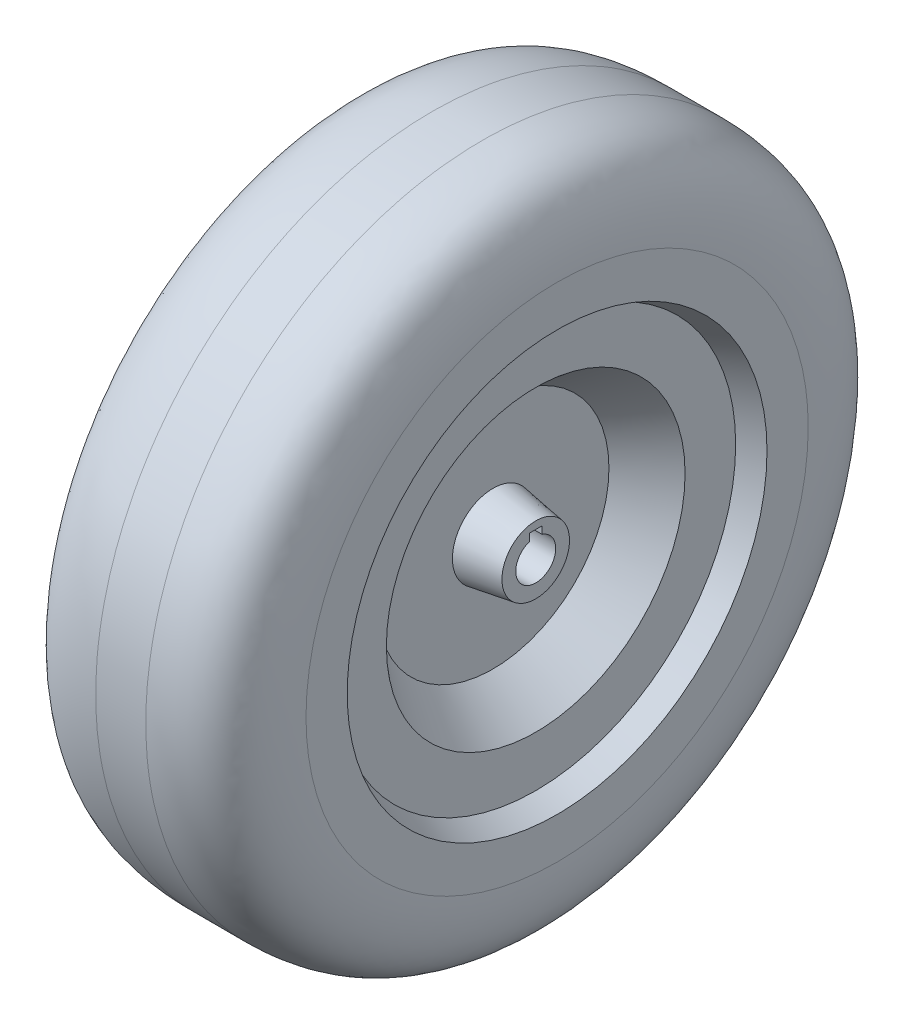
ISO-10303-21;
HEADER;
FILE_DESCRIPTION(('STEP AP214'),'2;1');
FILE_NAME('part.step','',(''),(''),'','','');
FILE_SCHEMA(('AUTOMOTIVE_DESIGN { 1 0 10303 214 1 1 1 1 }'));
ENDSEC;
DATA;
#1=APPLICATION_CONTEXT('core data for automotive mechanical design processes');
#2=APPLICATION_PROTOCOL_DEFINITION('international standard','automotive_design',2000,#1);
#3=PRODUCT_CONTEXT('',#1,'mechanical');
#4=PRODUCT('Part','Part','',(#3));
#5=PRODUCT_RELATED_PRODUCT_CATEGORY('part','',(#4));
#6=PRODUCT_DEFINITION_FORMATION('','',#4);
#7=PRODUCT_DEFINITION_CONTEXT('part definition',#1,'design');
#8=PRODUCT_DEFINITION('design','',#6,#7);
#9=PRODUCT_DEFINITION_SHAPE('','',#8);
#10=(LENGTH_UNIT() NAMED_UNIT(*) SI_UNIT(.MILLI.,.METRE.));
#11=(NAMED_UNIT(*) PLANE_ANGLE_UNIT() SI_UNIT($,.RADIAN.));
#12=(NAMED_UNIT(*) SI_UNIT($,.STERADIAN.) SOLID_ANGLE_UNIT());
#13=UNCERTAINTY_MEASURE_WITH_UNIT(LENGTH_MEASURE(1.E-05),#10,'distance_accuracy_value','');
#14=(GEOMETRIC_REPRESENTATION_CONTEXT(3) GLOBAL_UNCERTAINTY_ASSIGNED_CONTEXT((#13)) GLOBAL_UNIT_ASSIGNED_CONTEXT((#10,
#11,#12)) REPRESENTATION_CONTEXT('',''));
#15=CARTESIAN_POINT('',(0.,0.,0.));
#16=DIRECTION('',(0.,0.,1.));
#17=DIRECTION('',(1.,0.,0.));
#18=AXIS2_PLACEMENT_3D('',#15,#16,#17);
#19=CARTESIAN_POINT('',(-89.84,0.,0.));
#20=DIRECTION('',(-1.,0.,0.));
#21=DIRECTION('',(0.,0.,-1.));
#22=AXIS2_PLACEMENT_3D('',#19,#20,#21);
#23=PLANE('',#22);
#24=DIRECTION('',(0.,-1.,0.));
#25=VECTOR('',#24,1.);
#26=CARTESIAN_POINT('',(-89.84,0.,-3.));
#27=LINE('',#26,#25);
#28=CARTESIAN_POINT('',(-89.84,12.5,-3.));
#29=VERTEX_POINT('',#28);
#30=CARTESIAN_POINT('',(-89.84,9.01387818865997,-3.));
#31=VERTEX_POINT('',#30);
#32=EDGE_CURVE('E78',#29,#31,#27,.T.);
#33=ORIENTED_EDGE('',*,*,#32,.F.);
#34=DIRECTION('',(0.,0.,1.));
#35=VECTOR('',#34,1.);
#36=CARTESIAN_POINT('',(-89.84,12.5,0.));
#37=LINE('',#36,#35);
#38=CARTESIAN_POINT('',(-89.84,12.5,3.));
#39=VERTEX_POINT('',#38);
#40=EDGE_CURVE('E103',#29,#39,#37,.T.);
#41=ORIENTED_EDGE('',*,*,#40,.T.);
#42=DIRECTION('',(0.,-1.,0.));
#43=VECTOR('',#42,1.);
#44=CARTESIAN_POINT('',(-89.84,0.,3.));
#45=LINE('',#44,#43);
#46=CARTESIAN_POINT('',(-89.84,9.01387818865997,3.));
#47=VERTEX_POINT('',#46);
#48=EDGE_CURVE('E94',#39,#47,#45,.T.);
#49=ORIENTED_EDGE('',*,*,#48,.T.);
#50=CARTESIAN_POINT('',(-89.84,0.,0.));
#51=DIRECTION('',(1.,0.,0.));
#52=DIRECTION('',(0.,0.,-1.));
#53=AXIS2_PLACEMENT_3D('',#50,#51,#52);
#54=CIRCLE('',#53,9.5);
#55=EDGE_CURVE('E131',#47,#31,#54,.T.);
#56=ORIENTED_EDGE('',*,*,#55,.T.);
#57=EDGE_LOOP('',(#33,#41,#49,#56));
#58=FACE_BOUND('',#57,.T.);
#59=CARTESIAN_POINT('',(-89.84,0.,0.));
#60=DIRECTION('',(-1.,0.,0.));
#61=DIRECTION('',(0.,-1.,0.));
#62=AXIS2_PLACEMENT_3D('',#59,#60,#61);
#63=CIRCLE('',#62,16.0655);
#64=CARTESIAN_POINT('',(-89.84,-16.0655,0.));
#65=VERTEX_POINT('',#64);
#66=EDGE_CURVE('E123',#65,#65,#63,.T.);
#67=ORIENTED_EDGE('',*,*,#66,.T.);
#68=EDGE_LOOP('',(#67));
#69=FACE_BOUND('',#68,.T.);
#70=ADVANCED_FACE('F50',(#58,#69),#23,.T.);
#71=CARTESIAN_POINT('',(-100.,0.,0.));
#72=DIRECTION('',(1.,0.,0.));
#73=DIRECTION('',(0.,0.,-1.));
#74=AXIS2_PLACEMENT_3D('',#71,#72,#73);
#75=CYLINDRICAL_SURFACE('',#74,9.5);
#76=CARTESIAN_POINT('',(-10.16,0.,0.));
#77=DIRECTION('',(1.,0.,0.));
#78=DIRECTION('',(0.,0.,-1.));
#79=AXIS2_PLACEMENT_3D('',#76,#77,#78);
#80=CIRCLE('',#79,9.5);
#81=CARTESIAN_POINT('',(-10.16,9.01387818865997,3.));
#82=VERTEX_POINT('',#81);
#83=CARTESIAN_POINT('',(-10.16,9.01387818865997,-3.));
#84=VERTEX_POINT('',#83);
#85=EDGE_CURVE('E158',#82,#84,#80,.T.);
#86=ORIENTED_EDGE('',*,*,#85,.T.);
#87=DIRECTION('',(1.,0.,0.));
#88=VECTOR('',#87,1.);
#89=CARTESIAN_POINT('',(-100.,9.01387818865997,-3.));
#90=LINE('',#89,#88);
#91=EDGE_CURVE('E115',#84,#31,#90,.F.);
#92=ORIENTED_EDGE('',*,*,#91,.T.);
#93=ORIENTED_EDGE('',*,*,#55,.F.);
#94=DIRECTION('',(1.,0.,0.));
#95=VECTOR('',#94,1.);
#96=CARTESIAN_POINT('',(-100.,9.01387818865997,3.));
#97=LINE('',#96,#95);
#98=EDGE_CURVE('E97',#82,#47,#97,.F.);
#99=ORIENTED_EDGE('',*,*,#98,.F.);
#100=EDGE_LOOP('',(#86,#92,#93,#99));
#101=FACE_BOUND('',#100,.T.);
#102=ADVANCED_FACE('F293',(#101),#75,.F.);
#103=CARTESIAN_POINT('',(-10.16,0.,0.));
#104=DIRECTION('',(1.,0.,0.));
#105=DIRECTION('',(0.,0.,-1.));
#106=AXIS2_PLACEMENT_3D('',#103,#104,#105);
#107=PLANE('',#106);
#108=DIRECTION('',(0.,1.,0.));
#109=VECTOR('',#108,1.);
#110=CARTESIAN_POINT('',(-10.16,0.,-3.));
#111=LINE('',#110,#109);
#112=CARTESIAN_POINT('',(-10.16,12.5,-3.));
#113=VERTEX_POINT('',#112);
#114=EDGE_CURVE('E12',#84,#113,#111,.T.);
#115=ORIENTED_EDGE('',*,*,#114,.F.);
#116=ORIENTED_EDGE('',*,*,#85,.F.);
#117=DIRECTION('',(0.,1.,0.));
#118=VECTOR('',#117,1.);
#119=CARTESIAN_POINT('',(-10.16,0.,3.));
#120=LINE('',#119,#118);
#121=CARTESIAN_POINT('',(-10.16,12.5,3.));
#122=VERTEX_POINT('',#121);
#123=EDGE_CURVE('E279',#82,#122,#120,.T.);
#124=ORIENTED_EDGE('',*,*,#123,.T.);
#125=DIRECTION('',(0.,0.,-1.));
#126=VECTOR('',#125,1.);
#127=CARTESIAN_POINT('',(-10.16,12.5,0.));
#128=LINE('',#127,#126);
#129=EDGE_CURVE('E63',#122,#113,#128,.T.);
#130=ORIENTED_EDGE('',*,*,#129,.T.);
#131=EDGE_LOOP('',(#115,#116,#124,#130));
#132=FACE_BOUND('',#131,.T.);
#133=CARTESIAN_POINT('',(-10.16,0.,0.));
#134=DIRECTION('',(-1.,0.,0.));
#135=DIRECTION('',(0.,-1.,0.));
#136=AXIS2_PLACEMENT_3D('',#133,#134,#135);
#137=CIRCLE('',#136,16.0655);
#138=CARTESIAN_POINT('',(-10.16,-16.0655,0.));
#139=VERTEX_POINT('',#138);
#140=EDGE_CURVE('E150',#139,#139,#137,.T.);
#141=ORIENTED_EDGE('',*,*,#140,.F.);
#142=EDGE_LOOP('',(#141));
#143=FACE_BOUND('',#142,.T.);
#144=ADVANCED_FACE('F289',(#132,#143),#107,.T.);
#145=CARTESIAN_POINT('',(-30.48,0.,0.));
#146=DIRECTION('',(1.,0.,0.));
#147=DIRECTION('',(0.,0.,-1.));
#148=AXIS2_PLACEMENT_3D('',#145,#146,#147);
#149=PLANE('',#148);
#150=CARTESIAN_POINT('',(-30.48,0.,0.));
#151=DIRECTION('',(1.,0.,0.));
#152=DIRECTION('',(0.,0.,-1.));
#153=AXIS2_PLACEMENT_3D('',#150,#151,#152);
#154=CIRCLE('',#153,55.1311425095124);
#155=CARTESIAN_POINT('',(-30.48,0.,-55.1311425095124));
#156=VERTEX_POINT('',#155);
#157=EDGE_CURVE('E166',#156,#156,#154,.T.);
#158=ORIENTED_EDGE('',*,*,#157,.T.);
#159=EDGE_LOOP('',(#158));
#160=FACE_BOUND('',#159,.T.);
#161=CARTESIAN_POINT('',(-30.48,0.,0.));
#162=DIRECTION('',(-1.,0.,0.));
#163=DIRECTION('',(0.,-1.,0.));
#164=AXIS2_PLACEMENT_3D('',#161,#162,#163);
#165=CIRCLE('',#164,19.2847995634458);
#166=CARTESIAN_POINT('',(-30.48,-19.2847995634458,0.));
#167=VERTEX_POINT('',#166);
#168=EDGE_CURVE('E154',#167,#167,#165,.T.);
#169=ORIENTED_EDGE('',*,*,#168,.T.);
#170=EDGE_LOOP('',(#169));
#171=FACE_BOUND('',#170,.T.);
#172=ADVANCED_FACE('F206',(#160,#171),#149,.T.);
#173=CARTESIAN_POINT('',(-100.,0.,0.));
#174=DIRECTION('',(1.,0.,0.));
#175=DIRECTION('',(0.,0.,-1.));
#176=AXIS2_PLACEMENT_3D('',#173,#174,#175);
#177=CYLINDRICAL_SURFACE('',#176,160.02);
#178=CARTESIAN_POINT('',(-35.56,0.,-160.02));
#179=CARTESIAN_POINT('',(-35.56,20.9465690178169,-160.02));
#180=CARTESIAN_POINT('',(-35.56,41.8848964553655,-155.855107720384));
#181=CARTESIAN_POINT('',(-35.56,80.5891092387578,-139.823297864528));
#182=CARTESIAN_POINT('',(-35.56,98.3397661305281,-127.962688120415));
#183=CARTESIAN_POINT('',(-35.56,127.962688120415,-98.3397661305281));
#184=CARTESIAN_POINT('',(-35.56,139.823297864571,-80.5891092386546));
#185=CARTESIAN_POINT('',(-35.56,155.855107720341,-41.8848964554685));
#186=CARTESIAN_POINT('',(-35.56,160.02,-20.946569017565));
#187=CARTESIAN_POINT('',(-35.56,160.02,20.946569017565));
#188=CARTESIAN_POINT('',(-35.56,155.855107720398,41.8848964553299));
#189=CARTESIAN_POINT('',(-35.56,139.823297864514,80.5891092387936));
#190=CARTESIAN_POINT('',(-35.56,127.962688120414,98.3397661305282));
#191=CARTESIAN_POINT('',(-35.56,98.339766130528,127.962688120415));
#192=CARTESIAN_POINT('',(-35.56,80.5891092387474,139.823297864533));
#193=CARTESIAN_POINT('',(-35.56,41.8848964553763,155.855107720379));
#194=CARTESIAN_POINT('',(-35.56,20.946569017565,160.02));
#195=CARTESIAN_POINT('',(-35.56,-20.946569017565,160.02));
#196=CARTESIAN_POINT('',(-35.56,-41.8848964554988,155.855107720328));
#197=CARTESIAN_POINT('',(-35.56,-80.5891092386241,139.823297864584));
#198=CARTESIAN_POINT('',(-35.56,-98.3397661305282,127.962688120414));
#199=CARTESIAN_POINT('',(-35.56,-127.962688120415,98.339766130528));
#200=CARTESIAN_POINT('',(-35.56,-139.823297864526,80.5891092387633));
#201=CARTESIAN_POINT('',(-35.56,-155.855107720386,41.8848964553604));
#202=CARTESIAN_POINT('',(-35.56,-160.02,20.9465690175648));
#203=CARTESIAN_POINT('',(-35.56,-160.02,-20.9465690175653));
#204=CARTESIAN_POINT('',(-35.56,-155.855107720328,-41.8848964554988));
#205=CARTESIAN_POINT('',(-35.56,-139.823297864584,-80.589109238624));
#206=CARTESIAN_POINT('',(-35.56,-127.962688120415,-98.3397661305277));
#207=CARTESIAN_POINT('',(-35.56,-98.3397661305285,-127.962688120414));
#208=CARTESIAN_POINT('',(-35.56,-80.5891092388241,-139.823297864501));
#209=CARTESIAN_POINT('',(-35.56,-41.8848964552996,-155.855107720411));
#210=CARTESIAN_POINT('',(-35.56,-20.9465690178169,-160.02));
#211=CARTESIAN_POINT('',(-35.56,0.,-160.02));
#212=(BOUNDED_CURVE() B_SPLINE_CURVE(3,(#178,#179,#180,#181,#182,#183,#184,#185,#186,#187,#188,
#189,#190,#191,#192,#193,#194,#195,#196,#197,#198,#199,#200,#201,#202,#203,#204,#205,#206,#207,
#208,#209,#210,#211),.UNSPECIFIED.,.T.,.F.) B_SPLINE_CURVE_WITH_KNOTS((4,2,2,2,2,2,2,2,2,2,2,2,
2,2,2,2,4),(0.,0.392699081698724,0.785398163397448,1.17809724509617,1.5707963267949,
1.96349540849362,2.35619449019234,2.74889357189107,3.14159265358979,3.53429173528852,
3.92699081698724,4.31968989868597,4.71238898038469,5.10508806208341,5.49778714378214,
5.89048622548086,6.28318530717959),
.UNSPECIFIED.) CURVE() GEOMETRIC_REPRESENTATION_ITEM() RATIONAL_B_SPLINE_CURVE((1.,1.,1.,1.,1.,
1.,1.,1.,1.,1.,1.,1.,1.,1.,1.,1.,1.,1.,1.,1.,1.,1.,1.,1.,1.,1.,1.,1.,1.,1.,1.,1.,1.,1.)) REPRESENTATION_ITEM(''));
#213=CARTESIAN_POINT('',(-35.56,0.,-160.02));
#214=VERTEX_POINT('',#213);
#215=EDGE_CURVE('E253',#214,#214,#212,.F.);
#216=ORIENTED_EDGE('',*,*,#215,.T.);
#217=EDGE_LOOP('',(#216));
#218=FACE_BOUND('',#217,.T.);
#219=CARTESIAN_POINT('',(-59.36,0.,-160.02));
#220=CARTESIAN_POINT('',(-59.36,-20.946569018133,-160.02));
#221=CARTESIAN_POINT('',(-59.36,-41.8848964553511,-155.85510772039));
#222=CARTESIAN_POINT('',(-59.36,-80.5891092387727,-139.823297864522));
#223=CARTESIAN_POINT('',(-59.36,-98.3397661305522,-127.96268812039));
#224=CARTESIAN_POINT('',(-59.36,-127.962688120391,-98.3397661305515));
#225=CARTESIAN_POINT('',(-59.36,-139.823297864516,-80.5891092387888));
#226=CARTESIAN_POINT('',(-59.36,-155.855107720397,-41.884896455334));
#227=CARTESIAN_POINT('',(-59.36,-160.02,-20.9465690175848));
#228=CARTESIAN_POINT('',(-59.36,-160.02,20.9465690175843));
#229=CARTESIAN_POINT('',(-59.36,-155.855107720357,41.884896455431));
#230=CARTESIAN_POINT('',(-59.36,-139.823297864555,80.5891092386927));
#231=CARTESIAN_POINT('',(-59.36,-127.962688120447,98.3397661304953));
#232=CARTESIAN_POINT('',(-59.36,-98.3397661304954,127.962688120447));
#233=CARTESIAN_POINT('',(-59.36,-80.5891092387406,139.823297864536));
#234=CARTESIAN_POINT('',(-59.36,-41.8848964553823,155.855107720377));
#235=CARTESIAN_POINT('',(-59.36,-20.9465690175845,160.02));
#236=CARTESIAN_POINT('',(-59.36,20.9465690175846,160.02));
#237=CARTESIAN_POINT('',(-59.36,41.8848964553828,155.855107720377));
#238=CARTESIAN_POINT('',(-59.36,80.589109238741,139.823297864535));
#239=CARTESIAN_POINT('',(-59.36,98.3397661306648,127.962688120278));
#240=CARTESIAN_POINT('',(-59.36,127.962688120278,98.339766130665));
#241=CARTESIAN_POINT('',(-59.36,139.823297864514,80.5891092387932));
#242=CARTESIAN_POINT('',(-59.36,155.855107720398,41.8848964553302));
#243=CARTESIAN_POINT('',(-59.36,160.02,20.9465690175846));
#244=CARTESIAN_POINT('',(-59.36,160.02,-20.9465690175846));
#245=CARTESIAN_POINT('',(-59.36,155.855107720365,-41.8848964554101));
#246=CARTESIAN_POINT('',(-59.36,139.823297864547,-80.5891092387131));
#247=CARTESIAN_POINT('',(-59.36,127.962688120348,-98.3397661305947));
#248=CARTESIAN_POINT('',(-59.36,98.3397661305947,-127.962688120348));
#249=CARTESIAN_POINT('',(-59.36,80.5891092388042,-139.823297864509));
#250=CARTESIAN_POINT('',(-59.36,41.8848964553192,-155.855107720403));
#251=CARTESIAN_POINT('',(-59.36,20.946569018133,-160.02));
#252=CARTESIAN_POINT('',(-59.36,0.,-160.02));
#253=(BOUNDED_CURVE() B_SPLINE_CURVE(3,(#219,#220,#221,#222,#223,#224,#225,#226,#227,#228,#229,
#230,#231,#232,#233,#234,#235,#236,#237,#238,#239,#240,#241,#242,#243,#244,#245,#246,#247,#248,
#249,#250,#251,#252),.UNSPECIFIED.,.T.,.F.) B_SPLINE_CURVE_WITH_KNOTS((4,2,2,2,2,2,2,2,2,2,2,2,
2,2,2,2,4),(0.,0.392699081698725,0.785398163397448,1.17809724509617,1.5707963267949,
1.96349540849362,2.35619449019234,2.74889357189107,3.14159265358979,3.53429173528852,
3.92699081698724,4.31968989868597,4.71238898038469,5.10508806208341,5.49778714378214,
5.89048622548086,6.28318530717959),
.UNSPECIFIED.) CURVE() GEOMETRIC_REPRESENTATION_ITEM() RATIONAL_B_SPLINE_CURVE((1.,1.,1.,1.,1.,
1.,1.,1.,1.,1.,1.,1.,1.,1.,1.,1.,1.,1.,1.,1.,1.,1.,1.,1.,1.,1.,1.,1.,1.,1.,1.,1.,1.,1.)) REPRESENTATION_ITEM(''));
#254=CARTESIAN_POINT('',(-59.36,0.,-160.02));
#255=VERTEX_POINT('',#254);
#256=EDGE_CURVE('E265',#255,#255,#253,.F.);
#257=ORIENTED_EDGE('',*,*,#256,.T.);
#258=EDGE_LOOP('',(#257));
#259=FACE_BOUND('',#258,.T.);
#260=ADVANCED_FACE('F203',(#218,#259),#177,.T.);
#261=CARTESIAN_POINT('',(-100.,0.,0.));
#262=DIRECTION('',(1.,0.,0.));
#263=DIRECTION('',(0.,0.,-1.));
#264=AXIS2_PLACEMENT_3D('',#261,#262,#263);
#265=PLANE('',#264);
#266=CARTESIAN_POINT('',(-100.,0.,-124.46));
#267=CARTESIAN_POINT('',(-100.,16.2917759029923,-124.46));
#268=CARTESIAN_POINT('',(-100.,32.5771416875201,-121.22063933804));
#269=CARTESIAN_POINT('',(-100.,62.680418296798,-108.75145389467));
#270=CARTESIAN_POINT('',(-100.,76.4864847681713,-99.5265352046711));
#271=CARTESIAN_POINT('',(-100.,99.5265352047841,-76.4864847682843));
#272=CARTESIAN_POINT('',(-100.,108.75145389474,-62.6804182967889));
#273=CARTESIAN_POINT('',(-100.,121.22063933797,-32.5771416875291));
#274=CARTESIAN_POINT('',(-100.,124.46,-16.2917759025658));
#275=CARTESIAN_POINT('',(-100.,124.46,16.2917759025658));
#276=CARTESIAN_POINT('',(-100.,121.220639338083,32.5771416874727));
#277=CARTESIAN_POINT('',(-100.,108.751453894626,62.6804182968455));
#278=CARTESIAN_POINT('',(-100.,99.5265352046918,76.4864847682636));
#279=CARTESIAN_POINT('',(-100.,76.4864847682635,99.5265352046919));
#280=CARTESIAN_POINT('',(-100.,62.6804182968254,108.751453894686));
#281=CARTESIAN_POINT('',(-100.,32.5771416874931,121.220639338024));
#282=CARTESIAN_POINT('',(-100.,16.2917759025658,124.46));
#283=CARTESIAN_POINT('',(-100.,-16.2917759025658,124.46));
#284=CARTESIAN_POINT('',(-100.,-32.5771416874927,121.220639338024));
#285=CARTESIAN_POINT('',(-100.,-62.680418296825,108.751453894686));
#286=CARTESIAN_POINT('',(-100.,-76.4864847682636,99.5265352048048));
#287=CARTESIAN_POINT('',(-100.,-99.5265352046919,76.4864847681504));
#288=CARTESIAN_POINT('',(-100.,-108.751453894686,62.6804182967688));
#289=CARTESIAN_POINT('',(-100.,-121.220639338024,32.5771416875496));
#290=CARTESIAN_POINT('',(-100.,-124.46,16.2917759025656));
#291=CARTESIAN_POINT('',(-100.,-124.46,-16.291775902566));
#292=CARTESIAN_POINT('',(-100.,-121.220639338024,-32.5771416874927));
#293=CARTESIAN_POINT('',(-100.,-108.751453894686,-62.680418296825));
#294=CARTESIAN_POINT('',(-100.,-99.5265352048051,-76.4864847682633));
#295=CARTESIAN_POINT('',(-100.,-76.4864847681507,-99.5265352046916));
#296=CARTESIAN_POINT('',(-100.,-62.6804182967688,-108.751453894573));
#297=CARTESIAN_POINT('',(-100.,-32.5771416875496,-121.220639338137));
#298=CARTESIAN_POINT('',(-100.,-16.2917759029924,-124.46));
#299=CARTESIAN_POINT('',(-100.,0.,-124.46));
#300=(BOUNDED_CURVE() B_SPLINE_CURVE(3,(#266,#267,#268,#269,#270,#271,#272,#273,#274,#275,#276,
#277,#278,#279,#280,#281,#282,#283,#284,#285,#286,#287,#288,#289,#290,#291,#292,#293,#294,#295,
#296,#297,#298,#299),.UNSPECIFIED.,.T.,.F.) B_SPLINE_CURVE_WITH_KNOTS((4,2,2,2,2,2,2,2,2,2,2,2,
2,2,2,2,4),(0.,0.392699081698724,0.785398163397448,1.17809724509617,1.5707963267949,
1.96349540849362,2.35619449019234,2.74889357189107,3.14159265358979,3.53429173528852,
3.92699081698724,4.31968989868597,4.71238898038469,5.10508806208341,5.49778714378214,
5.89048622548086,6.28318530717959),
.UNSPECIFIED.) CURVE() GEOMETRIC_REPRESENTATION_ITEM() RATIONAL_B_SPLINE_CURVE((1.,1.,1.,1.,1.,
1.,1.,1.,1.,1.,1.,1.,1.,1.,1.,1.,1.,1.,1.,1.,1.,1.,1.,1.,1.,1.,1.,1.,1.,1.,1.,1.,1.,1.)) REPRESENTATION_ITEM(''));
#301=CARTESIAN_POINT('',(-100.,0.,-124.46));
#302=VERTEX_POINT('',#301);
#303=EDGE_CURVE('E231',#302,#302,#300,.F.);
#304=ORIENTED_EDGE('',*,*,#303,.T.);
#305=EDGE_LOOP('',(#304));
#306=FACE_BOUND('',#305,.T.);
#307=CARTESIAN_POINT('',(-100.,0.,0.));
#308=DIRECTION('',(1.,0.,0.));
#309=DIRECTION('',(0.,0.,-1.));
#310=AXIS2_PLACEMENT_3D('',#307,#308,#309);
#311=CIRCLE('',#310,99.7964488474852);
#312=CARTESIAN_POINT('',(-100.,0.,-99.7964488474852));
#313=VERTEX_POINT('',#312);
#314=EDGE_CURVE('E146',#313,#313,#311,.T.);
#315=ORIENTED_EDGE('',*,*,#314,.T.);
#316=EDGE_LOOP('',(#315));
#317=FACE_BOUND('',#316,.T.);
#318=ADVANCED_FACE('F200',(#306,#317),#265,.F.);
#319=CARTESIAN_POINT('',(0.,0.,0.));
#320=DIRECTION('',(1.,0.,0.));
#321=DIRECTION('',(0.,0.,-1.));
#322=AXIS2_PLACEMENT_3D('',#319,#320,#321);
#323=PLANE('',#322);
#324=CARTESIAN_POINT('',(0.,0.,-119.38));
#325=CARTESIAN_POINT('',(0.,-15.6268054577364,-119.38));
#326=CARTESIAN_POINT('',(0.,-31.247462434931,-116.272858140607));
#327=CARTESIAN_POINT('',(0.,-60.1220338765581,-104.312619041788));
#328=CARTESIAN_POINT('',(0.,-73.3645874307014,-95.4642276452902));
#329=CARTESIAN_POINT('',(0.,-95.4642276453991,-73.3645874308093));
#330=CARTESIAN_POINT('',(0.,-104.312619041788,-60.1220338764493));
#331=CARTESIAN_POINT('',(0.,-116.272858140607,-31.2474624350391));
#332=CARTESIAN_POINT('',(0.,-119.38,-15.6268054575487));
#333=CARTESIAN_POINT('',(0.,-119.38,15.6268054575483));
#334=CARTESIAN_POINT('',(0.,-116.272858140498,31.247462434931));
#335=CARTESIAN_POINT('',(0.,-104.312619041896,60.1220338765581));
#336=CARTESIAN_POINT('',(0.,-95.464227645399,73.3645874307011));
#337=CARTESIAN_POINT('',(0.,-73.3645874307012,95.4642276453989));
#338=CARTESIAN_POINT('',(0.,-60.1220338764493,104.312619041788));
#339=CARTESIAN_POINT('',(0.,-31.2474624350391,116.272858140607));
#340=CARTESIAN_POINT('',(0.,-15.6268054575485,119.38));
#341=CARTESIAN_POINT('',(0.,15.6268054575485,119.38));
#342=CARTESIAN_POINT('',(0.,31.2474624349852,116.272858140498));
#343=CARTESIAN_POINT('',(0.,60.1220338765039,104.312619041896));
#344=CARTESIAN_POINT('',(0.,73.364587430701,95.464227645399));
#345=CARTESIAN_POINT('',(0.,95.4642276453989,73.3645874307012));
#346=CARTESIAN_POINT('',(0.,104.312619041788,60.122033876558));
#347=CARTESIAN_POINT('',(0.,116.272858140607,31.2474624349309));
#348=CARTESIAN_POINT('',(0.,119.38,15.6268054575485));
#349=CARTESIAN_POINT('',(0.,119.38,-15.6268054575485));
#350=CARTESIAN_POINT('',(0.,116.272858140607,-31.2474624350393));
#351=CARTESIAN_POINT('',(0.,104.312619041788,-60.1220338764495));
#352=CARTESIAN_POINT('',(0.,95.4642276453989,-73.3645874307011));
#353=CARTESIAN_POINT('',(0.,73.3645874307011,-95.4642276453989));
#354=CARTESIAN_POINT('',(0.,60.1220338765165,-104.312619041828));
#355=CARTESIAN_POINT('',(0.,31.2474624349723,-116.272858140567));
#356=CARTESIAN_POINT('',(0.,15.6268054577364,-119.38));
#357=CARTESIAN_POINT('',(0.,0.,-119.38));
#358=(BOUNDED_CURVE() B_SPLINE_CURVE(3,(#324,#325,#326,#327,#328,#329,#330,#331,#332,#333,#334,
#335,#336,#337,#338,#339,#340,#341,#342,#343,#344,#345,#346,#347,#348,#349,#350,#351,#352,#353,
#354,#355,#356,#357),.UNSPECIFIED.,.T.,.F.) B_SPLINE_CURVE_WITH_KNOTS((4,2,2,2,2,2,2,2,2,2,2,2,
2,2,2,2,4),(0.,0.392699081698725,0.785398163397448,1.17809724509617,1.5707963267949,
1.96349540849362,2.35619449019234,2.74889357189107,3.14159265358979,3.53429173528852,
3.92699081698724,4.31968989868597,4.71238898038469,5.10508806208341,5.49778714378214,
5.89048622548086,6.28318530717959),
.UNSPECIFIED.) CURVE() GEOMETRIC_REPRESENTATION_ITEM() RATIONAL_B_SPLINE_CURVE((1.,1.,1.,1.,1.,
1.,1.,1.,1.,1.,1.,1.,1.,1.,1.,1.,1.,1.,1.,1.,1.,1.,1.,1.,1.,1.,1.,1.,1.,1.,1.,1.,1.,1.)) REPRESENTATION_ITEM(''));
#359=CARTESIAN_POINT('',(0.,0.,-119.38));
#360=VERTEX_POINT('',#359);
#361=EDGE_CURVE('E178',#360,#360,#358,.F.);
#362=ORIENTED_EDGE('',*,*,#361,.T.);
#363=EDGE_LOOP('',(#362));
#364=FACE_BOUND('',#363,.T.);
#365=CARTESIAN_POINT('',(0.,0.,0.));
#366=DIRECTION('',(1.,0.,0.));
#367=DIRECTION('',(0.,0.,-1.));
#368=AXIS2_PLACEMENT_3D('',#365,#366,#367);
#369=CIRCLE('',#368,99.7964488474852);
#370=CARTESIAN_POINT('',(0.,0.,-99.7964488474852));
#371=VERTEX_POINT('',#370);
#372=EDGE_CURVE('E170',#371,#371,#369,.T.);
#373=ORIENTED_EDGE('',*,*,#372,.F.);
#374=EDGE_LOOP('',(#373));
#375=FACE_BOUND('',#374,.T.);
#376=ADVANCED_FACE('F189',(#364,#375),#323,.T.);
#377=CARTESIAN_POINT('',(-10.16,0.,0.));
#378=DIRECTION('',(1.,0.,0.));
#379=DIRECTION('',(0.,0.,-1.));
#380=AXIS2_PLACEMENT_3D('',#377,#378,#379);
#381=PLANE('',#380);
#382=CARTESIAN_POINT('',(-10.16,0.,0.));
#383=DIRECTION('',(1.,0.,0.));
#384=DIRECTION('',(0.,0.,-1.));
#385=AXIS2_PLACEMENT_3D('',#382,#383,#384);
#386=CIRCLE('',#385,71.0068664401289);
#387=CARTESIAN_POINT('',(-10.16,0.,-71.0068664401289));
#388=VERTEX_POINT('',#387);
#389=EDGE_CURVE('E162',#388,#388,#386,.T.);
#390=ORIENTED_EDGE('',*,*,#389,.F.);
#391=EDGE_LOOP('',(#390));
#392=FACE_BOUND('',#391,.T.);
#393=CARTESIAN_POINT('',(-10.16,0.,0.));
#394=DIRECTION('',(1.,0.,0.));
#395=DIRECTION('',(0.,0.,-1.));
#396=AXIS2_PLACEMENT_3D('',#393,#394,#395);
#397=CIRCLE('',#396,95.0587630406304);
#398=CARTESIAN_POINT('',(-10.16,0.,-95.0587630406304));
#399=VERTEX_POINT('',#398);
#400=EDGE_CURVE('E174',#399,#399,#397,.T.);
#401=ORIENTED_EDGE('',*,*,#400,.T.);
#402=EDGE_LOOP('',(#401));
#403=FACE_BOUND('',#402,.T.);
#404=ADVANCED_FACE('F199',(#392,#403),#381,.T.);
#405=CARTESIAN_POINT('',(0.,0.,0.));
#406=DIRECTION('',(1.,0.,0.));
#407=DIRECTION('',(0.,0.,-1.));
#408=AXIS2_PLACEMENT_3D('',#405,#406,#407);
#409=CONICAL_SURFACE('',#408,99.7964488474852,0.436332312998583);
#410=ORIENTED_EDGE('',*,*,#400,.F.);
#411=EDGE_LOOP('',(#410));
#412=FACE_BOUND('',#411,.T.);
#413=ORIENTED_EDGE('',*,*,#372,.T.);
#414=EDGE_LOOP('',(#413));
#415=FACE_BOUND('',#414,.T.);
#416=ADVANCED_FACE('F342',(#412,#415),#409,.F.);
#417=CARTESIAN_POINT('',(-10.16,0.,0.));
#418=DIRECTION('',(1.,0.,0.));
#419=DIRECTION('',(0.,0.,-1.));
#420=AXIS2_PLACEMENT_3D('',#417,#418,#419);
#421=CONICAL_SURFACE('',#420,71.0068664401289,0.663225115757846);
#422=ORIENTED_EDGE('',*,*,#157,.F.);
#423=EDGE_LOOP('',(#422));
#424=FACE_BOUND('',#423,.T.);
#425=ORIENTED_EDGE('',*,*,#389,.T.);
#426=EDGE_LOOP('',(#425));
#427=FACE_BOUND('',#426,.T.);
#428=ADVANCED_FACE('F334',(#424,#427),#421,.F.);
#429=CARTESIAN_POINT('',(-30.48,0.,0.));
#430=DIRECTION('',(-1.,0.,0.));
#431=DIRECTION('',(0.,-1.,0.));
#432=AXIS2_PLACEMENT_3D('',#429,#430,#431);
#433=CONICAL_SURFACE('',#432,19.2847995634458,0.157124171377775);
#434=ORIENTED_EDGE('',*,*,#140,.T.);
#435=EDGE_LOOP('',(#434));
#436=FACE_BOUND('',#435,.T.);
#437=ORIENTED_EDGE('',*,*,#168,.F.);
#438=EDGE_LOOP('',(#437));
#439=FACE_BOUND('',#438,.T.);
#440=ADVANCED_FACE('F327',(#436,#439),#433,.T.);
#441=CARTESIAN_POINT('',(-89.84,0.,0.));
#442=DIRECTION('',(-1.,0.,0.));
#443=DIRECTION('',(0.,0.,-1.));
#444=AXIS2_PLACEMENT_3D('',#441,#442,#443);
#445=PLANE('',#444);
#446=CARTESIAN_POINT('',(-89.84,0.,0.));
#447=DIRECTION('',(1.,0.,0.));
#448=DIRECTION('',(0.,0.,-1.));
#449=AXIS2_PLACEMENT_3D('',#446,#447,#448);
#450=CIRCLE('',#449,71.0068664401289);
#451=CARTESIAN_POINT('',(-89.84,0.,-71.0068664401289));
#452=VERTEX_POINT('',#451);
#453=EDGE_CURVE('E134',#452,#452,#450,.T.);
#454=ORIENTED_EDGE('',*,*,#453,.T.);
#455=EDGE_LOOP('',(#454));
#456=FACE_BOUND('',#455,.T.);
#457=CARTESIAN_POINT('',(-89.84,0.,0.));
#458=DIRECTION('',(-1.,0.,0.));
#459=DIRECTION('',(0.,0.,1.));
#460=AXIS2_PLACEMENT_3D('',#457,#458,#459);
#461=CIRCLE('',#460,95.0587630406304);
#462=CARTESIAN_POINT('',(-89.84,0.,95.0587630406304));
#463=VERTEX_POINT('',#462);
#464=EDGE_CURVE('E142',#463,#463,#461,.F.);
#465=ORIENTED_EDGE('',*,*,#464,.F.);
#466=EDGE_LOOP('',(#465));
#467=FACE_BOUND('',#466,.T.);
#468=ADVANCED_FACE('F324',(#456,#467),#445,.T.);
#469=CARTESIAN_POINT('',(-100.,0.,0.));
#470=DIRECTION('',(-1.,0.,0.));
#471=DIRECTION('',(0.,0.,-1.));
#472=AXIS2_PLACEMENT_3D('',#469,#470,#471);
#473=CONICAL_SURFACE('',#472,99.7964488474852,0.436332312998583);
#474=ORIENTED_EDGE('',*,*,#464,.T.);
#475=EDGE_LOOP('',(#474));
#476=FACE_BOUND('',#475,.T.);
#477=ORIENTED_EDGE('',*,*,#314,.F.);
#478=EDGE_LOOP('',(#477));
#479=FACE_BOUND('',#478,.T.);
#480=ADVANCED_FACE('F319',(#476,#479),#473,.F.);
#481=CARTESIAN_POINT('',(-69.52,0.,0.));
#482=DIRECTION('',(-1.,0.,0.));
#483=DIRECTION('',(0.,0.,-1.));
#484=AXIS2_PLACEMENT_3D('',#481,#482,#483);
#485=PLANE('',#484);
#486=CARTESIAN_POINT('',(-69.52,0.,0.));
#487=DIRECTION('',(-1.,0.,0.));
#488=DIRECTION('',(0.,-1.,0.));
#489=AXIS2_PLACEMENT_3D('',#486,#487,#488);
#490=CIRCLE('',#489,19.2847995634458);
#491=CARTESIAN_POINT('',(-69.52,-19.2847995634458,0.));
#492=VERTEX_POINT('',#491);
#493=EDGE_CURVE('E127',#492,#492,#490,.T.);
#494=ORIENTED_EDGE('',*,*,#493,.F.);
#495=EDGE_LOOP('',(#494));
#496=FACE_BOUND('',#495,.T.);
#497=CARTESIAN_POINT('',(-69.52,0.,0.));
#498=DIRECTION('',(-1.,0.,0.));
#499=DIRECTION('',(0.,0.,1.));
#500=AXIS2_PLACEMENT_3D('',#497,#498,#499);
#501=CIRCLE('',#500,55.1311425095123);
#502=CARTESIAN_POINT('',(-69.52,0.,55.1311425095123));
#503=VERTEX_POINT('',#502);
#504=EDGE_CURVE('E138',#503,#503,#501,.F.);
#505=ORIENTED_EDGE('',*,*,#504,.F.);
#506=EDGE_LOOP('',(#505));
#507=FACE_BOUND('',#506,.T.);
#508=ADVANCED_FACE('F315',(#496,#507),#485,.T.);
#509=CARTESIAN_POINT('',(-89.84,0.,0.));
#510=DIRECTION('',(-1.,0.,0.));
#511=DIRECTION('',(0.,0.,-1.));
#512=AXIS2_PLACEMENT_3D('',#509,#510,#511);
#513=CONICAL_SURFACE('',#512,71.0068664401289,0.663225115757846);
#514=ORIENTED_EDGE('',*,*,#504,.T.);
#515=EDGE_LOOP('',(#514));
#516=FACE_BOUND('',#515,.T.);
#517=ORIENTED_EDGE('',*,*,#453,.F.);
#518=EDGE_LOOP('',(#517));
#519=FACE_BOUND('',#518,.T.);
#520=ADVANCED_FACE('F318',(#516,#519),#513,.F.);
#521=CARTESIAN_POINT('',(-69.52,0.,0.));
#522=DIRECTION('',(1.,0.,0.));
#523=DIRECTION('',(0.,-1.,0.));
#524=AXIS2_PLACEMENT_3D('',#521,#522,#523);
#525=CONICAL_SURFACE('',#524,19.2847995634458,0.157124171377775);
#526=ORIENTED_EDGE('',*,*,#66,.F.);
#527=EDGE_LOOP('',(#526));
#528=FACE_BOUND('',#527,.T.);
#529=ORIENTED_EDGE('',*,*,#493,.T.);
#530=EDGE_LOOP('',(#529));
#531=FACE_BOUND('',#530,.T.);
#532=ADVANCED_FACE('F314',(#528,#531),#525,.T.);
#533=CARTESIAN_POINT('',(0.,0.,-119.38));
#534=CARTESIAN_POINT('',(0.,15.6268054577364,-119.38));
#535=CARTESIAN_POINT('',(0.,31.2474624349723,-116.272858140567));
#536=CARTESIAN_POINT('',(0.,60.1220338765165,-104.312619041828));
#537=CARTESIAN_POINT('',(0.,73.3645874307011,-95.4642276453989));
#538=CARTESIAN_POINT('',(0.,95.4642276453989,-73.3645874307011));
#539=CARTESIAN_POINT('',(0.,104.312619041788,-60.1220338764495));
#540=CARTESIAN_POINT('',(0.,116.272858140607,-31.2474624350393));
#541=CARTESIAN_POINT('',(0.,119.38,-15.6268054575485));
#542=CARTESIAN_POINT('',(0.,119.38,15.6268054575485));
#543=CARTESIAN_POINT('',(0.,116.272858140607,31.2474624349309));
#544=CARTESIAN_POINT('',(0.,104.312619041788,60.122033876558));
#545=CARTESIAN_POINT('',(0.,95.4642276453989,73.3645874307012));
#546=CARTESIAN_POINT('',(0.,73.364587430701,95.464227645399));
#547=CARTESIAN_POINT('',(0.,60.1220338765039,104.312619041896));
#548=CARTESIAN_POINT('',(0.,31.2474624349852,116.272858140498));
#549=CARTESIAN_POINT('',(0.,15.6268054575485,119.38));
#550=CARTESIAN_POINT('',(0.,-15.6268054575485,119.38));
#551=CARTESIAN_POINT('',(0.,-31.2474624350391,116.272858140607));
#552=CARTESIAN_POINT('',(0.,-60.1220338764493,104.312619041788));
#553=CARTESIAN_POINT('',(0.,-73.3645874307012,95.4642276453989));
#554=CARTESIAN_POINT('',(0.,-95.464227645399,73.3645874307011));
#555=CARTESIAN_POINT('',(0.,-104.312619041896,60.1220338765581));
#556=CARTESIAN_POINT('',(0.,-116.272858140498,31.247462434931));
#557=CARTESIAN_POINT('',(0.,-119.38,15.6268054575483));
#558=CARTESIAN_POINT('',(0.,-119.38,-15.6268054575487));
#559=CARTESIAN_POINT('',(0.,-116.272858140607,-31.2474624350391));
#560=CARTESIAN_POINT('',(0.,-104.312619041788,-60.1220338764493));
#561=CARTESIAN_POINT('',(0.,-95.4642276453991,-73.3645874308093));
#562=CARTESIAN_POINT('',(0.,-73.3645874307014,-95.4642276452902));
#563=CARTESIAN_POINT('',(0.,-60.1220338765581,-104.312619041788));
#564=CARTESIAN_POINT('',(0.,-31.247462434931,-116.272858140607));
#565=CARTESIAN_POINT('',(0.,-15.6268054577364,-119.38));
#566=CARTESIAN_POINT('',(0.,0.,-119.38));
#567=CARTESIAN_POINT('',(0.,0.,-160.02));
#568=CARTESIAN_POINT('',(0.,20.9465690178169,-160.02));
#569=CARTESIAN_POINT('',(0.,41.8848964553815,-155.855107720422));
#570=CARTESIAN_POINT('',(0.,80.5891092387418,-139.82329786449));
#571=CARTESIAN_POINT('',(0.,98.3397661305281,-127.962688120415));
#572=CARTESIAN_POINT('',(0.,127.962688120415,-98.3397661305281));
#573=CARTESIAN_POINT('',(-5.42163725643791E-11,139.823297864437,-80.5891092385989));
#574=CARTESIAN_POINT('',(5.42163725643791E-11,155.855107720476,-41.8848964555243));
#575=CARTESIAN_POINT('',(0.,160.02,-20.946569017565));
#576=CARTESIAN_POINT('',(0.,160.02,20.946569017565));
#577=CARTESIAN_POINT('',(0.,155.855107720476,41.884896455416));
#578=CARTESIAN_POINT('',(0.,139.823297864437,80.5891092387074));
#579=CARTESIAN_POINT('',(-1.08439684022662E-10,127.962688120523,98.3397661305282));
#580=CARTESIAN_POINT('',(1.08425806234854E-10,98.3397661304196,127.962688120415));
#581=CARTESIAN_POINT('',(0.,80.5891092387076,139.823297864437));
#582=CARTESIAN_POINT('',(0.,41.8848964554161,155.855107720475));
#583=CARTESIAN_POINT('',(0.,20.946569017565,160.02));
#584=CARTESIAN_POINT('',(0.,-20.946569017565,160.02));
#585=CARTESIAN_POINT('',(0.,-41.8848964554699,155.855107720259));
#586=CARTESIAN_POINT('',(0.,-80.589109238653,139.823297864654));
#587=CARTESIAN_POINT('',(-1.08439684022662E-10,-98.3397661305282,127.962688120523));
#588=CARTESIAN_POINT('',(1.08425806234854E-10,-127.962688120415,98.3397661304196));
#589=CARTESIAN_POINT('',(0.,-139.823297864653,80.589109238816));
#590=CARTESIAN_POINT('',(0.,-155.855107720259,41.8848964553077));
#591=CARTESIAN_POINT('',(-5.42094336704752E-11,-160.02,20.9465690175648));
#592=CARTESIAN_POINT('',(5.42233114582831E-11,-160.02,-20.9465690175653));
#593=CARTESIAN_POINT('',(-5.42233114582831E-11,-155.855107720259,-41.8848964554157));
#594=CARTESIAN_POINT('',(5.42094336704752E-11,-139.823297864654,-80.5891092387071));
#595=CARTESIAN_POINT('',(0.,-127.962688120415,-98.3397661305278));
#596=CARTESIAN_POINT('',(0.,-98.3397661305284,-127.962688120414));
#597=CARTESIAN_POINT('',(0.,-80.5891092387618,-139.82329786422));
#598=CARTESIAN_POINT('',(0.,-41.8848964553619,-155.855107720692));
#599=CARTESIAN_POINT('',(0.,-20.9465690178169,-160.02));
#600=CARTESIAN_POINT('',(0.,0.,-160.02));
#601=CARTESIAN_POINT('',(-35.56,0.,-160.02));
#602=CARTESIAN_POINT('',(-35.56,20.9465690178169,-160.02));
#603=CARTESIAN_POINT('',(-35.56,41.8848964553655,-155.855107720384));
#604=CARTESIAN_POINT('',(-35.56,80.5891092387578,-139.823297864528));
#605=CARTESIAN_POINT('',(-35.56,98.3397661305281,-127.962688120415));
#606=CARTESIAN_POINT('',(-35.56,127.962688120415,-98.3397661305281));
#607=CARTESIAN_POINT('',(-35.56,139.823297864571,-80.5891092386546));
#608=CARTESIAN_POINT('',(-35.56,155.855107720341,-41.8848964554685));
#609=CARTESIAN_POINT('',(-35.56,160.02,-20.946569017565));
#610=CARTESIAN_POINT('',(-35.56,160.02,20.946569017565));
#611=CARTESIAN_POINT('',(-35.56,155.855107720398,41.8848964553299));
#612=CARTESIAN_POINT('',(-35.56,139.823297864514,80.5891092387936));
#613=CARTESIAN_POINT('',(-35.56,127.962688120414,98.3397661305282));
#614=CARTESIAN_POINT('',(-35.56,98.339766130528,127.962688120415));
#615=CARTESIAN_POINT('',(-35.56,80.5891092387474,139.823297864533));
#616=CARTESIAN_POINT('',(-35.56,41.8848964553763,155.855107720379));
#617=CARTESIAN_POINT('',(-35.56,20.946569017565,160.02));
#618=CARTESIAN_POINT('',(-35.56,-20.946569017565,160.02));
#619=CARTESIAN_POINT('',(-35.56,-41.8848964554988,155.855107720328));
#620=CARTESIAN_POINT('',(-35.56,-80.5891092386241,139.823297864584));
#621=CARTESIAN_POINT('',(-35.56,-98.3397661305282,127.962688120414));
#622=CARTESIAN_POINT('',(-35.56,-127.962688120415,98.339766130528));
#623=CARTESIAN_POINT('',(-35.56,-139.823297864526,80.5891092387633));
#624=CARTESIAN_POINT('',(-35.56,-155.855107720386,41.8848964553604));
#625=CARTESIAN_POINT('',(-35.56,-160.02,20.9465690175648));
#626=CARTESIAN_POINT('',(-35.56,-160.02,-20.9465690175653));
#627=CARTESIAN_POINT('',(-35.56,-155.855107720328,-41.8848964554988));
#628=CARTESIAN_POINT('',(-35.56,-139.823297864584,-80.589109238624));
#629=CARTESIAN_POINT('',(-35.56,-127.962688120415,-98.3397661305277));
#630=CARTESIAN_POINT('',(-35.56,-98.3397661305285,-127.962688120414));
#631=CARTESIAN_POINT('',(-35.56,-80.5891092388241,-139.823297864501));
#632=CARTESIAN_POINT('',(-35.56,-41.8848964552996,-155.855107720411));
#633=CARTESIAN_POINT('',(-35.56,-20.9465690178169,-160.02));
#634=CARTESIAN_POINT('',(-35.56,0.,-160.02));
#635=(BOUNDED_SURFACE() B_SPLINE_SURFACE(2,3,((#533,#534,#535,#536,#537,#538,#539,#540,#541,
#542,#543,#544,#545,#546,#547,#548,#549,#550,#551,#552,#553,#554,#555,#556,#557,#558,#559,#560,
#561,#562,#563,#564,#565,#566),(#567,#568,#569,#570,#571,#572,#573,#574,#575,#576,#577,#578,
#579,#580,#581,#582,#583,#584,#585,#586,#587,#588,#589,#590,#591,#592,#593,#594,#595,#596,#597,
#598,#599,#600),(#601,#602,#603,#604,#605,#606,#607,#608,#609,#610,#611,#612,#613,#614,#615,
#616,#617,#618,#619,#620,#621,#622,#623,#624,#625,#626,#627,#628,#629,#630,#631,#632,#633,
#634)),.UNSPECIFIED.,.F.,.T.,.F.) B_SPLINE_SURFACE_WITH_KNOTS((3,3),(4,2,2,2,2,2,2,2,2,2,2,2,2,
2,2,2,4),(0.,1.),(0.,0.392699081698724,0.785398163397448,1.17809724509617,1.5707963267949,
1.96349540849362,2.35619449019234,2.74889357189107,3.14159265358979,3.53429173528852,
3.92699081698724,4.31968989868597,4.71238898038469,5.10508806208341,5.49778714378214,
5.89048622548086,6.28318530717959),
.UNSPECIFIED.) GEOMETRIC_REPRESENTATION_ITEM() RATIONAL_B_SPLINE_SURFACE(((1.,1.,1.,1.,1.,1.,1.,
1.,1.,1.,1.,1.,1.,1.,1.,1.,1.,1.,1.,1.,1.,1.,1.,1.,1.,1.,1.,1.,1.,1.,1.,1.,1.,1.),
(1.22222222222222,1.22222222222222,1.22222222222222,1.22222222222222,1.22222222222222,
1.22222222222222,1.22222222222222,1.22222222222222,1.22222222222222,1.22222222222222,
1.22222222222222,1.22222222222222,1.22222222222222,1.22222222222222,1.22222222222222,
1.22222222222222,1.22222222222222,1.22222222222222,1.22222222222222,1.22222222222222,
1.22222222222222,1.22222222222222,1.22222222222222,1.22222222222222,1.22222222222222,
1.22222222222222,1.22222222222222,1.22222222222222,1.22222222222222,1.22222222222222,
1.22222222222222,1.22222222222222,1.22222222222222,1.22222222222222),(1.,1.,1.,1.,1.,1.,1.,1.,
1.,1.,1.,1.,1.,1.,1.,1.,1.,1.,1.,1.,1.,1.,1.,1.,1.,1.,1.,1.,1.,1.,1.,1.,1.,1.))) REPRESENTATION_ITEM('') SURFACE());
#636=ORIENTED_EDGE('',*,*,#215,.F.);
#637=EDGE_LOOP('',(#636));
#638=FACE_BOUND('',#637,.T.);
#639=ORIENTED_EDGE('',*,*,#361,.F.);
#640=EDGE_LOOP('',(#639));
#641=FACE_BOUND('',#640,.T.);
#642=ADVANCED_FACE('F209',(#638,#641),#635,.T.);
#643=CARTESIAN_POINT('',(-59.36,0.,-160.02));
#644=CARTESIAN_POINT('',(-59.36,20.946569018133,-160.02));
#645=CARTESIAN_POINT('',(-59.36,41.8848964553192,-155.855107720403));
#646=CARTESIAN_POINT('',(-59.36,80.5891092388042,-139.823297864509));
#647=CARTESIAN_POINT('',(-59.36,98.3397661305947,-127.962688120348));
#648=CARTESIAN_POINT('',(-59.36,127.962688120348,-98.3397661305947));
#649=CARTESIAN_POINT('',(-59.36,139.823297864547,-80.5891092387131));
#650=CARTESIAN_POINT('',(-59.36,155.855107720365,-41.8848964554101));
#651=CARTESIAN_POINT('',(-59.36,160.02,-20.9465690175846));
#652=CARTESIAN_POINT('',(-59.36,160.02,20.9465690175846));
#653=CARTESIAN_POINT('',(-59.36,155.855107720398,41.8848964553302));
#654=CARTESIAN_POINT('',(-59.36,139.823297864514,80.5891092387932));
#655=CARTESIAN_POINT('',(-59.36,127.962688120278,98.339766130665));
#656=CARTESIAN_POINT('',(-59.36,98.3397661306648,127.962688120278));
#657=CARTESIAN_POINT('',(-59.36,80.589109238741,139.823297864535));
#658=CARTESIAN_POINT('',(-59.36,41.8848964553828,155.855107720377));
#659=CARTESIAN_POINT('',(-59.36,20.9465690175846,160.02));
#660=CARTESIAN_POINT('',(-59.36,-20.9465690175845,160.02));
#661=CARTESIAN_POINT('',(-59.36,-41.8848964553823,155.855107720377));
#662=CARTESIAN_POINT('',(-59.36,-80.5891092387406,139.823297864536));
#663=CARTESIAN_POINT('',(-59.36,-98.3397661304954,127.962688120447));
#664=CARTESIAN_POINT('',(-59.36,-127.962688120447,98.3397661304953));
#665=CARTESIAN_POINT('',(-59.36,-139.823297864555,80.5891092386927));
#666=CARTESIAN_POINT('',(-59.36,-155.855107720357,41.884896455431));
#667=CARTESIAN_POINT('',(-59.36,-160.02,20.9465690175843));
#668=CARTESIAN_POINT('',(-59.36,-160.02,-20.9465690175848));
#669=CARTESIAN_POINT('',(-59.36,-155.855107720397,-41.884896455334));
#670=CARTESIAN_POINT('',(-59.36,-139.823297864516,-80.5891092387888));
#671=CARTESIAN_POINT('',(-59.36,-127.962688120391,-98.3397661305515));
#672=CARTESIAN_POINT('',(-59.36,-98.3397661305522,-127.96268812039));
#673=CARTESIAN_POINT('',(-59.36,-80.5891092387727,-139.823297864522));
#674=CARTESIAN_POINT('',(-59.36,-41.8848964553511,-155.85510772039));
#675=CARTESIAN_POINT('',(-59.36,-20.946569018133,-160.02));
#676=CARTESIAN_POINT('',(-59.36,0.,-160.02));
#677=CARTESIAN_POINT('',(-100.,0.,-160.02));
#678=CARTESIAN_POINT('',(-100.,20.946569018133,-160.02));
#679=CARTESIAN_POINT('',(-100.,41.8848964552457,-155.855107720498));
#680=CARTESIAN_POINT('',(-100.,80.5891092388776,-139.823297864414));
#681=CARTESIAN_POINT('',(-100.,98.3397661304252,-127.962688120291));
#682=CARTESIAN_POINT('',(-100.,127.962688120517,-98.3397661306513));
#683=CARTESIAN_POINT('',(-99.999999999887,139.82329786481,-80.5891092387286));
#684=CARTESIAN_POINT('',(-100.000000000113,155.855107720102,-41.8848964553946));
#685=CARTESIAN_POINT('',(-100.,160.02,-20.9465690175846));
#686=CARTESIAN_POINT('',(-100.,160.02,20.9465690175846));
#687=CARTESIAN_POINT('',(-100.,155.855107720554,41.8848964553947));
#688=CARTESIAN_POINT('',(-100.,139.823297864358,80.5891092387287));
#689=CARTESIAN_POINT('',(-100.,127.962688120334,98.3397661308346));
#690=CARTESIAN_POINT('',(-100.,98.3397661306083,127.962688120108));
#691=CARTESIAN_POINT('',(-100.,80.5891092387593,139.82329786458));
#692=CARTESIAN_POINT('',(-100.,41.8848964553644,155.855107720332));
#693=CARTESIAN_POINT('',(-100.,20.9465690175846,160.02));
#694=CARTESIAN_POINT('',(-100.,-20.9465690175845,160.02));
#695=CARTESIAN_POINT('',(-99.9999999998869,-41.884896455364,155.855107720559));
#696=CARTESIAN_POINT('',(-100.000000000113,-80.5891092387589,139.823297864354));
#697=CARTESIAN_POINT('',(-99.999999999887,-98.3397661304954,127.962688120447));
#698=CARTESIAN_POINT('',(-100.000000000113,-127.962688120447,98.3397661304953));
#699=CARTESIAN_POINT('',(-100.,-139.82329786458,80.5891092386463));
#700=CARTESIAN_POINT('',(-100.,-155.855107720332,41.8848964554774));
#701=CARTESIAN_POINT('',(-100.,-160.02,20.9465690175843));
#702=CARTESIAN_POINT('',(-100.,-160.02,-20.9465690175848));
#703=CARTESIAN_POINT('',(-99.999999999887,-155.855107720559,-41.8848964553074));
#704=CARTESIAN_POINT('',(-100.000000000113,-139.823297864354,-80.5891092388154));
#705=CARTESIAN_POINT('',(-100.,-127.962688120561,-98.3397661306081));
#706=CARTESIAN_POINT('',(-100.,-98.3397661303826,-127.962688120334));
#707=CARTESIAN_POINT('',(-100.,-80.5891092387593,-139.823297864354));
#708=CARTESIAN_POINT('',(-100.,-41.8848964553644,-155.855107720558));
#709=CARTESIAN_POINT('',(-100.,-20.946569018133,-160.02));
#710=CARTESIAN_POINT('',(-100.,0.,-160.02));
#711=CARTESIAN_POINT('',(-100.,0.,-124.46));
#712=CARTESIAN_POINT('',(-100.,16.2917759029923,-124.46));
#713=CARTESIAN_POINT('',(-100.,32.5771416875201,-121.22063933804));
#714=CARTESIAN_POINT('',(-100.,62.680418296798,-108.75145389467));
#715=CARTESIAN_POINT('',(-100.,76.4864847681713,-99.5265352046711));
#716=CARTESIAN_POINT('',(-100.,99.5265352047841,-76.4864847682843));
#717=CARTESIAN_POINT('',(-100.,108.75145389474,-62.6804182967889));
#718=CARTESIAN_POINT('',(-100.,121.22063933797,-32.5771416875291));
#719=CARTESIAN_POINT('',(-100.,124.46,-16.2917759025658));
#720=CARTESIAN_POINT('',(-100.,124.46,16.2917759025658));
#721=CARTESIAN_POINT('',(-100.,121.220639338083,32.5771416874727));
#722=CARTESIAN_POINT('',(-100.,108.751453894626,62.6804182968455));
#723=CARTESIAN_POINT('',(-100.,99.5265352046918,76.4864847682636));
#724=CARTESIAN_POINT('',(-100.,76.4864847682635,99.5265352046919));
#725=CARTESIAN_POINT('',(-100.,62.6804182968254,108.751453894686));
#726=CARTESIAN_POINT('',(-100.,32.5771416874931,121.220639338024));
#727=CARTESIAN_POINT('',(-100.,16.2917759025658,124.46));
#728=CARTESIAN_POINT('',(-100.,-16.2917759025658,124.46));
#729=CARTESIAN_POINT('',(-100.,-32.5771416874927,121.220639338024));
#730=CARTESIAN_POINT('',(-100.,-62.680418296825,108.751453894686));
#731=CARTESIAN_POINT('',(-100.,-76.4864847682636,99.5265352048048));
#732=CARTESIAN_POINT('',(-100.,-99.5265352046919,76.4864847681504));
#733=CARTESIAN_POINT('',(-100.,-108.751453894686,62.6804182967688));
#734=CARTESIAN_POINT('',(-100.,-121.220639338024,32.5771416875496));
#735=CARTESIAN_POINT('',(-100.,-124.46,16.2917759025656));
#736=CARTESIAN_POINT('',(-100.,-124.46,-16.291775902566));
#737=CARTESIAN_POINT('',(-100.,-121.220639338024,-32.5771416874927));
#738=CARTESIAN_POINT('',(-100.,-108.751453894686,-62.680418296825));
#739=CARTESIAN_POINT('',(-100.,-99.5265352048051,-76.4864847682633));
#740=CARTESIAN_POINT('',(-100.,-76.4864847681507,-99.5265352046916));
#741=CARTESIAN_POINT('',(-100.,-62.6804182967688,-108.751453894573));
#742=CARTESIAN_POINT('',(-100.,-32.5771416875496,-121.220639338137));
#743=CARTESIAN_POINT('',(-100.,-16.2917759029924,-124.46));
#744=CARTESIAN_POINT('',(-100.,0.,-124.46));
#745=(BOUNDED_SURFACE() B_SPLINE_SURFACE(2,3,((#643,#644,#645,#646,#647,#648,#649,#650,#651,
#652,#653,#654,#655,#656,#657,#658,#659,#660,#661,#662,#663,#664,#665,#666,#667,#668,#669,#670,
#671,#672,#673,#674,#675,#676),(#677,#678,#679,#680,#681,#682,#683,#684,#685,#686,#687,#688,
#689,#690,#691,#692,#693,#694,#695,#696,#697,#698,#699,#700,#701,#702,#703,#704,#705,#706,#707,
#708,#709,#710),(#711,#712,#713,#714,#715,#716,#717,#718,#719,#720,#721,#722,#723,#724,#725,
#726,#727,#728,#729,#730,#731,#732,#733,#734,#735,#736,#737,#738,#739,#740,#741,#742,#743,
#744)),.UNSPECIFIED.,.F.,.T.,.F.) B_SPLINE_SURFACE_WITH_KNOTS((3,3),(4,2,2,2,2,2,2,2,2,2,2,2,2,
2,2,2,4),(0.,1.),(0.,0.392699081698724,0.785398163397448,1.17809724509617,1.5707963267949,
1.96349540849362,2.35619449019234,2.74889357189107,3.14159265358979,3.53429173528852,
3.92699081698724,4.31968989868597,4.71238898038469,5.10508806208341,5.49778714378214,
5.89048622548086,6.28318530717959),
.UNSPECIFIED.) GEOMETRIC_REPRESENTATION_ITEM() RATIONAL_B_SPLINE_SURFACE(((1.,1.,1.,1.,1.,1.,1.,
1.,1.,1.,1.,1.,1.,1.,1.,1.,1.,1.,1.,1.,1.,1.,1.,1.,1.,1.,1.,1.,1.,1.,1.,1.,1.,1.),
(1.22222222222222,1.22222222222222,1.22222222222222,1.22222222222222,1.22222222222222,
1.22222222222222,1.22222222222222,1.22222222222222,1.22222222222222,1.22222222222222,
1.22222222222222,1.22222222222222,1.22222222222222,1.22222222222222,1.22222222222222,
1.22222222222222,1.22222222222222,1.22222222222222,1.22222222222222,1.22222222222222,
1.22222222222222,1.22222222222222,1.22222222222222,1.22222222222222,1.22222222222222,
1.22222222222222,1.22222222222222,1.22222222222222,1.22222222222222,1.22222222222222,
1.22222222222222,1.22222222222222,1.22222222222222,1.22222222222222),(1.,1.,1.,1.,1.,1.,1.,1.,
1.,1.,1.,1.,1.,1.,1.,1.,1.,1.,1.,1.,1.,1.,1.,1.,1.,1.,1.,1.,1.,1.,1.,1.,1.,1.))) REPRESENTATION_ITEM('') SURFACE());
#746=ORIENTED_EDGE('',*,*,#303,.F.);
#747=EDGE_LOOP('',(#746));
#748=FACE_BOUND('',#747,.T.);
#749=ORIENTED_EDGE('',*,*,#256,.F.);
#750=EDGE_LOOP('',(#749));
#751=FACE_BOUND('',#750,.T.);
#752=ADVANCED_FACE('F53',(#748,#751),#745,.T.);
#753=CARTESIAN_POINT('',(0.177800000000006,12.5,-3.));
#754=DIRECTION('',(0.,0.,-1.));
#755=DIRECTION('',(0.,1.,0.));
#756=AXIS2_PLACEMENT_3D('',#753,#754,#755);
#757=PLANE('',#756);
#758=ORIENTED_EDGE('',*,*,#32,.T.);
#759=ORIENTED_EDGE('',*,*,#91,.F.);
#760=ORIENTED_EDGE('',*,*,#114,.T.);
#761=DIRECTION('',(-1.,0.,0.));
#762=VECTOR('',#761,1.);
#763=CARTESIAN_POINT('',(0.177800000000006,12.5,-3.));
#764=LINE('',#763,#762);
#765=EDGE_CURVE('E111',#113,#29,#764,.T.);
#766=ORIENTED_EDGE('',*,*,#765,.T.);
#767=EDGE_LOOP('',(#758,#759,#760,#766));
#768=FACE_BOUND('',#767,.T.);
#769=ADVANCED_FACE('F297',(#768),#757,.F.);
#770=CARTESIAN_POINT('',(0.177800000000006,12.5,-3.));
#771=DIRECTION('',(0.,-1.,0.));
#772=DIRECTION('',(0.,0.,-1.));
#773=AXIS2_PLACEMENT_3D('',#770,#771,#772);
#774=PLANE('',#773);
#775=ORIENTED_EDGE('',*,*,#765,.F.);
#776=ORIENTED_EDGE('',*,*,#129,.F.);
#777=DIRECTION('',(-1.,0.,0.));
#778=VECTOR('',#777,1.);
#779=CARTESIAN_POINT('',(0.177800000000006,12.5,3.));
#780=LINE('',#779,#778);
#781=EDGE_CURVE('E70',#122,#39,#780,.T.);
#782=ORIENTED_EDGE('',*,*,#781,.T.);
#783=ORIENTED_EDGE('',*,*,#40,.F.);
#784=EDGE_LOOP('',(#775,#776,#782,#783));
#785=FACE_BOUND('',#784,.T.);
#786=ADVANCED_FACE('F107',(#785),#774,.T.);
#787=CARTESIAN_POINT('',(0.177800000000006,12.5,3.));
#788=DIRECTION('',(0.,0.,-1.));
#789=DIRECTION('',(0.,1.,0.));
#790=AXIS2_PLACEMENT_3D('',#787,#788,#789);
#791=PLANE('',#790);
#792=ORIENTED_EDGE('',*,*,#781,.F.);
#793=ORIENTED_EDGE('',*,*,#123,.F.);
#794=ORIENTED_EDGE('',*,*,#98,.T.);
#795=ORIENTED_EDGE('',*,*,#48,.F.);
#796=EDGE_LOOP('',(#792,#793,#794,#795));
#797=FACE_BOUND('',#796,.T.);
#798=ADVANCED_FACE('F95',(#797),#791,.T.);
#799=CLOSED_SHELL('',(#70,#102,#144,#172,#260,#318,#376,#404,#416,#428,#440,#468,#480,#508,#520,
#532,#642,#752,#769,#786,#798));
#800=MANIFOLD_SOLID_BREP('B2',#799);
#801=ADVANCED_BREP_SHAPE_REPRESENTATION('',(#18,#800),#14);
#802=SHAPE_DEFINITION_REPRESENTATION(#9,#801);
ENDSEC;
END-ISO-10303-21;
